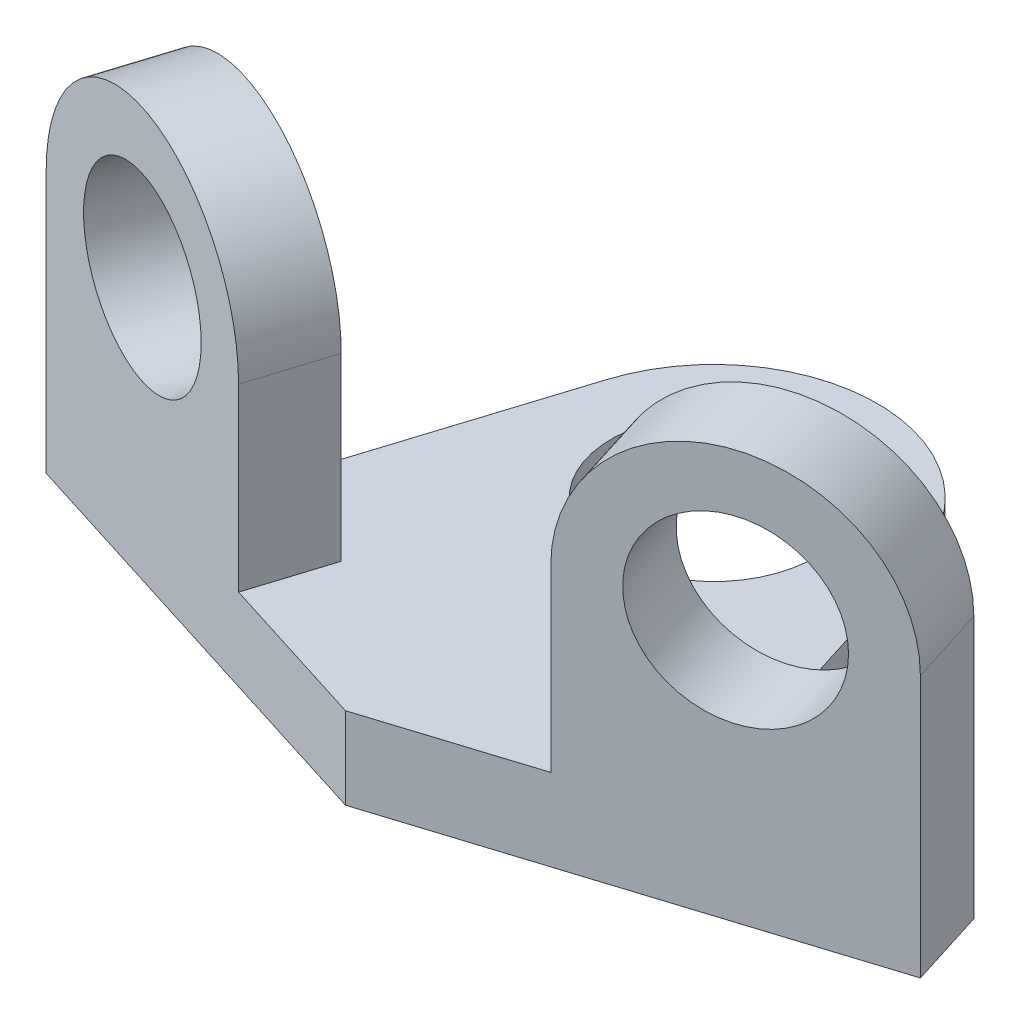
ISO-10303-21;
HEADER;
FILE_DESCRIPTION(('STEP AP214'),'2;1');
FILE_NAME('part.step','',(''),(''),'','','');
FILE_SCHEMA(('AUTOMOTIVE_DESIGN { 1 0 10303 214 1 1 1 1 }'));
ENDSEC;
DATA;
#1=APPLICATION_CONTEXT('core data for automotive mechanical design processes');
#2=APPLICATION_PROTOCOL_DEFINITION('international standard','automotive_design',2000,#1);
#3=PRODUCT_CONTEXT('',#1,'mechanical');
#4=PRODUCT('Part','Part','',(#3));
#5=PRODUCT_RELATED_PRODUCT_CATEGORY('part','',(#4));
#6=PRODUCT_DEFINITION_FORMATION('','',#4);
#7=PRODUCT_DEFINITION_CONTEXT('part definition',#1,'design');
#8=PRODUCT_DEFINITION('design','',#6,#7);
#9=PRODUCT_DEFINITION_SHAPE('','',#8);
#10=(LENGTH_UNIT() NAMED_UNIT(*) SI_UNIT(.MILLI.,.METRE.));
#11=(NAMED_UNIT(*) PLANE_ANGLE_UNIT() SI_UNIT($,.RADIAN.));
#12=(NAMED_UNIT(*) SI_UNIT($,.STERADIAN.) SOLID_ANGLE_UNIT());
#13=UNCERTAINTY_MEASURE_WITH_UNIT(LENGTH_MEASURE(1.E-05),#10,'distance_accuracy_value','');
#14=(GEOMETRIC_REPRESENTATION_CONTEXT(3) GLOBAL_UNCERTAINTY_ASSIGNED_CONTEXT((#13)) GLOBAL_UNIT_ASSIGNED_CONTEXT((#10,
#11,#12)) REPRESENTATION_CONTEXT('',''));
#15=CARTESIAN_POINT('',(0.,0.,0.));
#16=DIRECTION('',(0.,0.,1.));
#17=DIRECTION('',(1.,0.,0.));
#18=AXIS2_PLACEMENT_3D('',#15,#16,#17);
#19=CARTESIAN_POINT('',(-12.9054698178985,10.,40.9309209965023));
#20=DIRECTION('',(-0.300705799504273,0.,0.953716950748227));
#21=DIRECTION('',(0.953716950748227,0.,0.300705799504273));
#22=AXIS2_PLACEMENT_3D('',#19,#20,#21);
#23=PLANE('',#22);
#24=CARTESIAN_POINT('',(-36.2412441284326,32.,33.5731796188376));
#25=DIRECTION('',(-0.300705799504273,0.,0.953716950748227));
#26=DIRECTION('',(0.953716950748227,0.,0.300705799504273));
#27=AXIS2_PLACEMENT_3D('',#24,#25,#26);
#28=CIRCLE('',#27,11.);
#29=CARTESIAN_POINT('',(-25.7503576702021,32.,36.8809434133846));
#30=VERTEX_POINT('',#29);
#31=EDGE_CURVE('E298',#30,#30,#28,.T.);
#32=ORIENTED_EDGE('',*,*,#31,.F.);
#33=EDGE_LOOP('',(#32));
#34=FACE_BOUND('',#33,.T.);
#35=DIRECTION('',(0.,-1.,0.));
#36=VECTOR('',#35,1.);
#37=CARTESIAN_POINT('',(-19.0743390149645,32.,38.9858840099145));
#38=LINE('',#37,#36);
#39=CARTESIAN_POINT('',(-19.0743390149645,32.,38.9858840099145));
#40=VERTEX_POINT('',#39);
#41=CARTESIAN_POINT('',(-19.0743390149645,10.,38.9858840099145));
#42=VERTEX_POINT('',#41);
#43=EDGE_CURVE('E220',#40,#42,#38,.T.);
#44=ORIENTED_EDGE('',*,*,#43,.F.);
#45=CARTESIAN_POINT('',(-36.2412441284326,32.,33.5731796188376));
#46=DIRECTION('',(-0.300705799504273,0.,0.953716950748227));
#47=DIRECTION('',(0.953716950748227,0.,0.300705799504273));
#48=AXIS2_PLACEMENT_3D('',#45,#46,#47);
#49=CIRCLE('',#48,18.);
#50=CARTESIAN_POINT('',(-53.4081492419007,32.,28.1604752277607));
#51=VERTEX_POINT('',#50);
#52=EDGE_CURVE('E287',#40,#51,#49,.T.);
#53=ORIENTED_EDGE('',*,*,#52,.T.);
#54=DIRECTION('',(0.,-1.,0.));
#55=VECTOR('',#54,1.);
#56=CARTESIAN_POINT('',(-53.4081492419007,32.,28.1604752277607));
#57=LINE('',#56,#55);
#58=CARTESIAN_POINT('',(-53.4081492419007,0.,28.1604752277607));
#59=VERTEX_POINT('',#58);
#60=EDGE_CURVE('E146',#51,#59,#57,.T.);
#61=ORIENTED_EDGE('',*,*,#60,.T.);
#62=DIRECTION('',(-0.953716950748227,0.,-0.300705799504273));
#63=VECTOR('',#62,1.);
#64=CARTESIAN_POINT('',(-12.9054698178985,0.,40.9309209965023));
#65=LINE('',#64,#63);
#66=CARTESIAN_POINT('',(0.,0.,45.));
#67=VERTEX_POINT('',#66);
#68=EDGE_CURVE('E141',#67,#59,#65,.T.);
#69=ORIENTED_EDGE('',*,*,#68,.F.);
#70=DIRECTION('',(0.,-1.,0.));
#71=VECTOR('',#70,1.);
#72=CARTESIAN_POINT('',(0.,10.,45.));
#73=LINE('',#72,#71);
#74=CARTESIAN_POINT('',(0.,10.,45.));
#75=VERTEX_POINT('',#74);
#76=EDGE_CURVE('E12',#75,#67,#73,.T.);
#77=ORIENTED_EDGE('',*,*,#76,.F.);
#78=DIRECTION('',(-0.953716950748227,0.,-0.300705799504273));
#79=VECTOR('',#78,1.);
#80=CARTESIAN_POINT('',(-12.9054698178985,10.,40.9309209965023));
#81=LINE('',#80,#79);
#82=EDGE_CURVE('E66',#75,#42,#81,.T.);
#83=ORIENTED_EDGE('',*,*,#82,.T.);
#84=EDGE_LOOP('',(#44,#53,#61,#69,#77,#83));
#85=FACE_BOUND('',#84,.T.);
#86=ADVANCED_FACE('F51',(#34,#85),#23,.T.);
#87=CARTESIAN_POINT('',(12.9054698178986,10.,40.9309209965023));
#88=DIRECTION('',(-0.300705799504274,0.,-0.953716950748227));
#89=DIRECTION('',(-0.953716950748227,0.,0.300705799504274));
#90=AXIS2_PLACEMENT_3D('',#87,#88,#89);
#91=PLANE('',#90);
#92=CARTESIAN_POINT('',(36.2412441284326,32.,33.5731796188376));
#93=DIRECTION('',(0.300705799504274,0.,0.953716950748227));
#94=DIRECTION('',(0.953716950748227,0.,-0.300705799504274));
#95=AXIS2_PLACEMENT_3D('',#92,#93,#94);
#96=CIRCLE('',#95,11.);
#97=CARTESIAN_POINT('',(46.7321305866631,32.,30.2654158242906));
#98=VERTEX_POINT('',#97);
#99=EDGE_CURVE('E279',#98,#98,#96,.T.);
#100=ORIENTED_EDGE('',*,*,#99,.F.);
#101=EDGE_LOOP('',(#100));
#102=FACE_BOUND('',#101,.T.);
#103=CARTESIAN_POINT('',(36.2412441284326,32.,33.5731796188376));
#104=DIRECTION('',(0.300705799504274,0.,0.953716950748227));
#105=DIRECTION('',(0.953716950748227,0.,-0.300705799504274));
#106=AXIS2_PLACEMENT_3D('',#103,#104,#105);
#107=CIRCLE('',#106,18.);
#108=CARTESIAN_POINT('',(53.4081492419007,32.,28.1604752277607));
#109=VERTEX_POINT('',#108);
#110=CARTESIAN_POINT('',(19.0743390149645,32.,38.9858840099145));
#111=VERTEX_POINT('',#110);
#112=EDGE_CURVE('E272',#109,#111,#107,.T.);
#113=ORIENTED_EDGE('',*,*,#112,.T.);
#114=DIRECTION('',(0.,-1.,0.));
#115=VECTOR('',#114,1.);
#116=CARTESIAN_POINT('',(19.0743390149645,32.,38.9858840099145));
#117=LINE('',#116,#115);
#118=CARTESIAN_POINT('',(19.0743390149645,10.,38.9858840099145));
#119=VERTEX_POINT('',#118);
#120=EDGE_CURVE('E242',#111,#119,#117,.T.);
#121=ORIENTED_EDGE('',*,*,#120,.T.);
#122=DIRECTION('',(0.953716950748227,0.,-0.300705799504274));
#123=VECTOR('',#122,1.);
#124=CARTESIAN_POINT('',(12.9054698178986,10.,40.9309209965023));
#125=LINE('',#124,#123);
#126=EDGE_CURVE('E251',#75,#119,#125,.T.);
#127=ORIENTED_EDGE('',*,*,#126,.F.);
#128=ORIENTED_EDGE('',*,*,#76,.T.);
#129=DIRECTION('',(0.953716950748227,0.,-0.300705799504274));
#130=VECTOR('',#129,1.);
#131=CARTESIAN_POINT('',(12.9054698178986,0.,40.9309209965023));
#132=LINE('',#131,#130);
#133=CARTESIAN_POINT('',(53.4081492419007,0.,28.1604752277607));
#134=VERTEX_POINT('',#133);
#135=EDGE_CURVE('E150',#67,#134,#132,.T.);
#136=ORIENTED_EDGE('',*,*,#135,.T.);
#137=DIRECTION('',(0.,-1.,0.));
#138=VECTOR('',#137,1.);
#139=CARTESIAN_POINT('',(53.4081492419007,32.,28.1604752277607));
#140=LINE('',#139,#138);
#141=EDGE_CURVE('E243',#109,#134,#140,.T.);
#142=ORIENTED_EDGE('',*,*,#141,.F.);
#143=EDGE_LOOP('',(#113,#121,#127,#128,#136,#142));
#144=FACE_BOUND('',#143,.T.);
#145=ADVANCED_FACE('F318',(#102,#144),#91,.F.);
#146=CARTESIAN_POINT('',(19.0743390149645,10.,-6.01411599008548));
#147=DIRECTION('',(0.953716950748227,0.,-0.300705799504274));
#148=DIRECTION('',(-0.300705799504274,0.,-0.953716950748227));
#149=AXIS2_PLACEMENT_3D('',#146,#147,#148);
#150=PLANE('',#149);
#151=DIRECTION('',(0.300705799504274,0.,0.953716950748227));
#152=VECTOR('',#151,1.);
#153=CARTESIAN_POINT('',(19.0743390149645,0.,-6.01411599008548));
#154=LINE('',#153,#152);
#155=CARTESIAN_POINT('',(19.0743390149645,0.,-6.01411599008548));
#156=VERTEX_POINT('',#155);
#157=CARTESIAN_POINT('',(28.9727508378204,0.,25.3796354989345));
#158=VERTEX_POINT('',#157);
#159=EDGE_CURVE('E155',#156,#158,#154,.T.);
#160=ORIENTED_EDGE('',*,*,#159,.F.);
#161=DIRECTION('',(0.,-1.,0.));
#162=VECTOR('',#161,1.);
#163=CARTESIAN_POINT('',(19.0743390149645,10.,-6.01411599008548));
#164=LINE('',#163,#162);
#165=CARTESIAN_POINT('',(19.0743390149645,10.,-6.01411599008548));
#166=VERTEX_POINT('',#165);
#167=EDGE_CURVE('E122',#166,#156,#164,.T.);
#168=ORIENTED_EDGE('',*,*,#167,.F.);
#169=DIRECTION('',(0.300705799504274,0.,0.953716950748227));
#170=VECTOR('',#169,1.);
#171=CARTESIAN_POINT('',(19.0743390149645,10.,-6.01411599008548));
#172=LINE('',#171,#170);
#173=CARTESIAN_POINT('',(28.9727508378204,10.,25.3796354989345));
#174=VERTEX_POINT('',#173);
#175=EDGE_CURVE('E116',#166,#174,#172,.T.);
#176=ORIENTED_EDGE('',*,*,#175,.T.);
#177=DIRECTION('',(0.,-1.,0.));
#178=VECTOR('',#177,1.);
#179=CARTESIAN_POINT('',(28.9727508378204,10.,25.3796354989345));
#180=LINE('',#179,#178);
#181=EDGE_CURVE('E58',#174,#158,#180,.T.);
#182=ORIENTED_EDGE('',*,*,#181,.T.);
#183=EDGE_LOOP('',(#160,#168,#176,#182));
#184=FACE_BOUND('',#183,.T.);
#185=ADVANCED_FACE('F171',(#184),#150,.T.);
#186=CARTESIAN_POINT('',(0.,10.,0.));
#187=DIRECTION('',(0.,-1.,0.));
#188=DIRECTION('',(0.,0.,-1.));
#189=AXIS2_PLACEMENT_3D('',#186,#187,#188);
#190=CYLINDRICAL_SURFACE('',#189,20.);
#191=CARTESIAN_POINT('',(0.,0.,0.));
#192=DIRECTION('',(0.,1.,0.));
#193=DIRECTION('',(0.,0.,1.));
#194=AXIS2_PLACEMENT_3D('',#191,#192,#193);
#195=CIRCLE('',#194,20.);
#196=CARTESIAN_POINT('',(-19.0743390149645,0.,-6.01411599008548));
#197=VERTEX_POINT('',#196);
#198=EDGE_CURVE('E84',#156,#197,#195,.T.);
#199=ORIENTED_EDGE('',*,*,#198,.T.);
#200=DIRECTION('',(0.,-1.,0.));
#201=VECTOR('',#200,1.);
#202=CARTESIAN_POINT('',(-19.0743390149645,10.,-6.01411599008548));
#203=LINE('',#202,#201);
#204=CARTESIAN_POINT('',(-19.0743390149645,10.,-6.01411599008548));
#205=VERTEX_POINT('',#204);
#206=EDGE_CURVE('E123',#205,#197,#203,.T.);
#207=ORIENTED_EDGE('',*,*,#206,.F.);
#208=CARTESIAN_POINT('',(0.,10.,0.));
#209=DIRECTION('',(0.,1.,0.));
#210=DIRECTION('',(0.,0.,1.));
#211=AXIS2_PLACEMENT_3D('',#208,#209,#210);
#212=CIRCLE('',#211,20.);
#213=EDGE_CURVE('E109',#166,#205,#212,.T.);
#214=ORIENTED_EDGE('',*,*,#213,.F.);
#215=ORIENTED_EDGE('',*,*,#167,.T.);
#216=EDGE_LOOP('',(#199,#207,#214,#215));
#217=FACE_BOUND('',#216,.T.);
#218=ADVANCED_FACE('F125',(#217),#190,.T.);
#219=CARTESIAN_POINT('',(-19.0743390149645,10.,-6.01411599008547));
#220=DIRECTION('',(0.953716950748227,0.,0.300705799504274));
#221=DIRECTION('',(0.300705799504274,0.,-0.953716950748227));
#222=AXIS2_PLACEMENT_3D('',#219,#220,#221);
#223=PLANE('',#222);
#224=DIRECTION('',(-0.300705799504274,0.,0.953716950748227));
#225=VECTOR('',#224,1.);
#226=CARTESIAN_POINT('',(-19.0743390149645,0.,-6.01411599008547));
#227=LINE('',#226,#225);
#228=CARTESIAN_POINT('',(-28.9727508378203,0.,25.3796354989345));
#229=VERTEX_POINT('',#228);
#230=EDGE_CURVE('E95',#197,#229,#227,.T.);
#231=ORIENTED_EDGE('',*,*,#230,.T.);
#232=DIRECTION('',(0.,-1.,0.));
#233=VECTOR('',#232,1.);
#234=CARTESIAN_POINT('',(-28.9727508378203,10.,25.3796354989345));
#235=LINE('',#234,#233);
#236=CARTESIAN_POINT('',(-28.9727508378203,10.,25.3796354989345));
#237=VERTEX_POINT('',#236);
#238=EDGE_CURVE('E124',#237,#229,#235,.T.);
#239=ORIENTED_EDGE('',*,*,#238,.F.);
#240=DIRECTION('',(-0.300705799504274,0.,0.953716950748227));
#241=VECTOR('',#240,1.);
#242=CARTESIAN_POINT('',(-19.0743390149645,10.,-6.01411599008547));
#243=LINE('',#242,#241);
#244=EDGE_CURVE('E111',#205,#237,#243,.T.);
#245=ORIENTED_EDGE('',*,*,#244,.F.);
#246=ORIENTED_EDGE('',*,*,#206,.T.);
#247=EDGE_LOOP('',(#231,#239,#245,#246));
#248=FACE_BOUND('',#247,.T.);
#249=ADVANCED_FACE('F130',(#248),#223,.F.);
#250=CARTESIAN_POINT('',(0.,10.,0.));
#251=DIRECTION('',(0.,-1.,0.));
#252=DIRECTION('',(0.,0.,-1.));
#253=AXIS2_PLACEMENT_3D('',#250,#251,#252);
#254=CYLINDRICAL_SURFACE('',#253,12.5);
#255=CARTESIAN_POINT('',(0.,10.,0.));
#256=DIRECTION('',(0.,1.,0.));
#257=DIRECTION('',(0.,0.,1.));
#258=AXIS2_PLACEMENT_3D('',#255,#256,#257);
#259=CIRCLE('',#258,12.5);
#260=CARTESIAN_POINT('',(0.,10.,12.5));
#261=VERTEX_POINT('',#260);
#262=EDGE_CURVE('E137',#261,#261,#259,.T.);
#263=ORIENTED_EDGE('',*,*,#262,.T.);
#264=EDGE_LOOP('',(#263));
#265=FACE_BOUND('',#264,.T.);
#266=CARTESIAN_POINT('',(0.,0.,0.));
#267=DIRECTION('',(0.,1.,0.));
#268=DIRECTION('',(0.,0.,1.));
#269=AXIS2_PLACEMENT_3D('',#266,#267,#268);
#270=CIRCLE('',#269,12.5);
#271=CARTESIAN_POINT('',(0.,0.,12.5));
#272=VERTEX_POINT('',#271);
#273=EDGE_CURVE('E159',#272,#272,#270,.T.);
#274=ORIENTED_EDGE('',*,*,#273,.F.);
#275=EDGE_LOOP('',(#274));
#276=FACE_BOUND('',#275,.T.);
#277=ADVANCED_FACE('F379',(#265,#276),#254,.F.);
#278=CARTESIAN_POINT('',(0.,10.,0.));
#279=DIRECTION('',(0.,1.,0.));
#280=DIRECTION('',(0.,0.,1.));
#281=AXIS2_PLACEMENT_3D('',#278,#279,#280);
#282=PLANE('',#281);
#283=ORIENTED_EDGE('',*,*,#82,.F.);
#284=ORIENTED_EDGE('',*,*,#126,.T.);
#285=DIRECTION('',(-0.300705799504275,0.,-0.953716950748226));
#286=VECTOR('',#285,1.);
#287=CARTESIAN_POINT('',(6.16886919706593,10.,-1.94503698658777));
#288=LINE('',#287,#286);
#289=CARTESIAN_POINT('',(16.0672810199218,10.,29.4487145024323));
#290=VERTEX_POINT('',#289);
#291=EDGE_CURVE('E260',#119,#290,#288,.T.);
#292=ORIENTED_EDGE('',*,*,#291,.T.);
#293=DIRECTION('',(0.953716950748226,0.,-0.300705799504274));
#294=VECTOR('',#293,1.);
#295=CARTESIAN_POINT('',(9.89841182285585,10.,31.39375148902));
#296=LINE('',#295,#294);
#297=EDGE_CURVE('E261',#290,#174,#296,.T.);
#298=ORIENTED_EDGE('',*,*,#297,.T.);
#299=ORIENTED_EDGE('',*,*,#175,.F.);
#300=ORIENTED_EDGE('',*,*,#213,.T.);
#301=ORIENTED_EDGE('',*,*,#244,.T.);
#302=DIRECTION('',(-0.953716950748227,0.,-0.300705799504273));
#303=VECTOR('',#302,1.);
#304=CARTESIAN_POINT('',(-9.89841182285581,10.,31.39375148902));
#305=LINE('',#304,#303);
#306=CARTESIAN_POINT('',(-16.0672810199218,10.,29.4487145024322));
#307=VERTEX_POINT('',#306);
#308=EDGE_CURVE('E129',#307,#237,#305,.T.);
#309=ORIENTED_EDGE('',*,*,#308,.F.);
#310=DIRECTION('',(0.300705799504274,0.,-0.953716950748227));
#311=VECTOR('',#310,1.);
#312=CARTESIAN_POINT('',(-6.16886919706599,10.,-1.94503698658778));
#313=LINE('',#312,#311);
#314=EDGE_CURVE('E135',#42,#307,#313,.T.);
#315=ORIENTED_EDGE('',*,*,#314,.F.);
#316=EDGE_LOOP('',(#283,#284,#292,#298,#299,#300,#301,#309,#315));
#317=FACE_BOUND('',#316,.T.);
#318=ORIENTED_EDGE('',*,*,#262,.F.);
#319=EDGE_LOOP('',(#318));
#320=FACE_BOUND('',#319,.T.);
#321=ADVANCED_FACE('F112',(#317,#320),#282,.T.);
#322=CARTESIAN_POINT('',(0.,0.,0.));
#323=DIRECTION('',(0.,1.,0.));
#324=DIRECTION('',(0.,0.,1.));
#325=AXIS2_PLACEMENT_3D('',#322,#323,#324);
#326=PLANE('',#325);
#327=DIRECTION('',(-0.953716950748227,0.,-0.300705799504273));
#328=VECTOR('',#327,1.);
#329=CARTESIAN_POINT('',(-9.89841182285581,0.,31.39375148902));
#330=LINE('',#329,#328);
#331=CARTESIAN_POINT('',(-50.401091246858,0.,18.6233057202784));
#332=VERTEX_POINT('',#331);
#333=EDGE_CURVE('E193',#229,#332,#330,.T.);
#334=ORIENTED_EDGE('',*,*,#333,.F.);
#335=ORIENTED_EDGE('',*,*,#230,.F.);
#336=ORIENTED_EDGE('',*,*,#198,.F.);
#337=ORIENTED_EDGE('',*,*,#159,.T.);
#338=DIRECTION('',(0.953716950748226,0.,-0.300705799504274));
#339=VECTOR('',#338,1.);
#340=CARTESIAN_POINT('',(9.89841182285585,0.,31.39375148902));
#341=LINE('',#340,#339);
#342=CARTESIAN_POINT('',(50.4010912468579,0.,18.6233057202784));
#343=VERTEX_POINT('',#342);
#344=EDGE_CURVE('E190',#158,#343,#341,.T.);
#345=ORIENTED_EDGE('',*,*,#344,.T.);
#346=DIRECTION('',(0.300705799504274,0.,0.953716950748227));
#347=VECTOR('',#346,1.);
#348=CARTESIAN_POINT('',(40.5026794240021,0.,-12.7704457687416));
#349=LINE('',#348,#347);
#350=EDGE_CURVE('E229',#343,#134,#349,.T.);
#351=ORIENTED_EDGE('',*,*,#350,.T.);
#352=ORIENTED_EDGE('',*,*,#135,.F.);
#353=ORIENTED_EDGE('',*,*,#68,.T.);
#354=DIRECTION('',(-0.300705799504273,0.,0.953716950748227));
#355=VECTOR('',#354,1.);
#356=CARTESIAN_POINT('',(-40.5026794240022,0.,-12.7704457687416));
#357=LINE('',#356,#355);
#358=EDGE_CURVE('E192',#332,#59,#357,.T.);
#359=ORIENTED_EDGE('',*,*,#358,.F.);
#360=EDGE_LOOP('',(#334,#335,#336,#337,#345,#351,#352,#353,#359));
#361=FACE_BOUND('',#360,.T.);
#362=ORIENTED_EDGE('',*,*,#273,.T.);
#363=EDGE_LOOP('',(#362));
#364=FACE_BOUND('',#363,.T.);
#365=ADVANCED_FACE('F181',(#361,#364),#326,.F.);
#366=CARTESIAN_POINT('',(9.89841182285585,32.,31.39375148902));
#367=DIRECTION('',(-0.300705799504274,0.,-0.953716950748226));
#368=DIRECTION('',(-0.953716950748226,0.,0.300705799504274));
#369=AXIS2_PLACEMENT_3D('',#366,#367,#368);
#370=PLANE('',#369);
#371=CARTESIAN_POINT('',(33.2341861333899,32.,24.0360101113553));
#372=DIRECTION('',(0.300705799504274,0.,0.953716950748227));
#373=DIRECTION('',(0.953716950748227,0.,-0.300705799504274));
#374=AXIS2_PLACEMENT_3D('',#371,#372,#373);
#375=CIRCLE('',#374,11.);
#376=CARTESIAN_POINT('',(43.7250725916204,32.,20.7282463168083));
#377=VERTEX_POINT('',#376);
#378=EDGE_CURVE('E280',#377,#377,#375,.T.);
#379=ORIENTED_EDGE('',*,*,#378,.T.);
#380=EDGE_LOOP('',(#379));
#381=FACE_BOUND('',#380,.T.);
#382=DIRECTION('',(0.,-1.,0.));
#383=VECTOR('',#382,1.);
#384=CARTESIAN_POINT('',(16.0672810199218,32.,29.4487145024323));
#385=LINE('',#384,#383);
#386=CARTESIAN_POINT('',(16.0672810199218,32.,29.4487145024323));
#387=VERTEX_POINT('',#386);
#388=EDGE_CURVE('E206',#387,#290,#385,.T.);
#389=ORIENTED_EDGE('',*,*,#388,.F.);
#390=CARTESIAN_POINT('',(33.2341861333899,32.,24.0360101113553));
#391=DIRECTION('',(0.300705799504274,0.,0.953716950748227));
#392=DIRECTION('',(0.953716950748227,0.,-0.300705799504274));
#393=AXIS2_PLACEMENT_3D('',#390,#391,#392);
#394=CIRCLE('',#393,18.);
#395=CARTESIAN_POINT('',(50.401091246858,32.,18.6233057202784));
#396=VERTEX_POINT('',#395);
#397=EDGE_CURVE('E237',#396,#387,#394,.T.);
#398=ORIENTED_EDGE('',*,*,#397,.F.);
#399=DIRECTION('',(0.,-1.,0.));
#400=VECTOR('',#399,1.);
#401=CARTESIAN_POINT('',(50.4010912468579,32.,18.6233057202784));
#402=LINE('',#401,#400);
#403=EDGE_CURVE('E231',#396,#343,#402,.T.);
#404=ORIENTED_EDGE('',*,*,#403,.T.);
#405=ORIENTED_EDGE('',*,*,#344,.F.);
#406=ORIENTED_EDGE('',*,*,#181,.F.);
#407=ORIENTED_EDGE('',*,*,#297,.F.);
#408=EDGE_LOOP('',(#389,#398,#404,#405,#406,#407));
#409=FACE_BOUND('',#408,.T.);
#410=ADVANCED_FACE('F364',(#381,#409),#370,.T.);
#411=CARTESIAN_POINT('',(6.16886919706593,32.,-1.94503698658777));
#412=DIRECTION('',(-0.953716950748226,0.,0.300705799504275));
#413=DIRECTION('',(0.300705799504275,0.,0.953716950748226));
#414=AXIS2_PLACEMENT_3D('',#411,#412,#413);
#415=PLANE('',#414);
#416=ORIENTED_EDGE('',*,*,#388,.T.);
#417=ORIENTED_EDGE('',*,*,#291,.F.);
#418=ORIENTED_EDGE('',*,*,#120,.F.);
#419=DIRECTION('',(-0.300705799504275,0.,-0.953716950748226));
#420=VECTOR('',#419,1.);
#421=CARTESIAN_POINT('',(6.16886919706593,32.,-1.94503698658777));
#422=LINE('',#421,#420);
#423=EDGE_CURVE('E221',#111,#387,#422,.T.);
#424=ORIENTED_EDGE('',*,*,#423,.T.);
#425=EDGE_LOOP('',(#416,#417,#418,#424));
#426=FACE_BOUND('',#425,.T.);
#427=ADVANCED_FACE('F356',(#426),#415,.T.);
#428=CARTESIAN_POINT('',(40.5026794240021,32.,-12.7704457687416));
#429=DIRECTION('',(0.953716950748227,0.,-0.300705799504274));
#430=DIRECTION('',(-0.300705799504274,0.,-0.953716950748227));
#431=AXIS2_PLACEMENT_3D('',#428,#429,#430);
#432=PLANE('',#431);
#433=ORIENTED_EDGE('',*,*,#350,.F.);
#434=ORIENTED_EDGE('',*,*,#403,.F.);
#435=DIRECTION('',(0.300705799504274,0.,0.953716950748227));
#436=VECTOR('',#435,1.);
#437=CARTESIAN_POINT('',(40.5026794240021,32.,-12.7704457687416));
#438=LINE('',#437,#436);
#439=EDGE_CURVE('E226',#396,#109,#438,.T.);
#440=ORIENTED_EDGE('',*,*,#439,.T.);
#441=ORIENTED_EDGE('',*,*,#141,.T.);
#442=EDGE_LOOP('',(#433,#434,#440,#441));
#443=FACE_BOUND('',#442,.T.);
#444=ADVANCED_FACE('F373',(#443),#432,.T.);
#445=CARTESIAN_POINT('',(-9.89841182285581,32.,31.39375148902));
#446=DIRECTION('',(-0.300705799504273,0.,0.953716950748227));
#447=DIRECTION('',(0.953716950748227,0.,0.300705799504273));
#448=AXIS2_PLACEMENT_3D('',#445,#446,#447);
#449=PLANE('',#448);
#450=CARTESIAN_POINT('',(-33.2341861333899,32.,24.0360101113553));
#451=DIRECTION('',(-0.300705799504273,0.,0.953716950748227));
#452=DIRECTION('',(0.953716950748227,0.,0.300705799504273));
#453=AXIS2_PLACEMENT_3D('',#450,#451,#452);
#454=CIRCLE('',#453,11.);
#455=CARTESIAN_POINT('',(-22.7432996751594,32.,27.3437739059023));
#456=VERTEX_POINT('',#455);
#457=EDGE_CURVE('E291',#456,#456,#454,.T.);
#458=ORIENTED_EDGE('',*,*,#457,.T.);
#459=EDGE_LOOP('',(#458));
#460=FACE_BOUND('',#459,.T.);
#461=DIRECTION('',(0.,-1.,0.));
#462=VECTOR('',#461,1.);
#463=CARTESIAN_POINT('',(-50.401091246858,32.,18.6233057202784));
#464=LINE('',#463,#462);
#465=CARTESIAN_POINT('',(-50.401091246858,32.,18.6233057202784));
#466=VERTEX_POINT('',#465);
#467=EDGE_CURVE('E209',#466,#332,#464,.T.);
#468=ORIENTED_EDGE('',*,*,#467,.F.);
#469=CARTESIAN_POINT('',(-33.2341861333899,32.,24.0360101113553));
#470=DIRECTION('',(-0.300705799504273,0.,0.953716950748227));
#471=DIRECTION('',(0.953716950748227,0.,0.300705799504273));
#472=AXIS2_PLACEMENT_3D('',#469,#470,#471);
#473=CIRCLE('',#472,18.);
#474=CARTESIAN_POINT('',(-16.0672810199218,32.,29.4487145024323));
#475=VERTEX_POINT('',#474);
#476=EDGE_CURVE('E285',#475,#466,#473,.T.);
#477=ORIENTED_EDGE('',*,*,#476,.F.);
#478=DIRECTION('',(0.,-1.,0.));
#479=VECTOR('',#478,1.);
#480=CARTESIAN_POINT('',(-16.0672810199218,32.,29.4487145024322));
#481=LINE('',#480,#479);
#482=EDGE_CURVE('E213',#475,#307,#481,.T.);
#483=ORIENTED_EDGE('',*,*,#482,.T.);
#484=ORIENTED_EDGE('',*,*,#308,.T.);
#485=ORIENTED_EDGE('',*,*,#238,.T.);
#486=ORIENTED_EDGE('',*,*,#333,.T.);
#487=EDGE_LOOP('',(#468,#477,#483,#484,#485,#486));
#488=FACE_BOUND('',#487,.T.);
#489=ADVANCED_FACE('F302',(#460,#488),#449,.F.);
#490=CARTESIAN_POINT('',(-40.5026794240022,32.,-12.7704457687416));
#491=DIRECTION('',(0.953716950748227,0.,0.300705799504273));
#492=DIRECTION('',(0.300705799504273,0.,-0.953716950748227));
#493=AXIS2_PLACEMENT_3D('',#490,#491,#492);
#494=PLANE('',#493);
#495=ORIENTED_EDGE('',*,*,#358,.T.);
#496=ORIENTED_EDGE('',*,*,#60,.F.);
#497=DIRECTION('',(-0.300705799504273,0.,0.953716950748227));
#498=VECTOR('',#497,1.);
#499=CARTESIAN_POINT('',(-40.5026794240022,32.,-12.7704457687416));
#500=LINE('',#499,#498);
#501=EDGE_CURVE('E200',#466,#51,#500,.T.);
#502=ORIENTED_EDGE('',*,*,#501,.F.);
#503=ORIENTED_EDGE('',*,*,#467,.T.);
#504=EDGE_LOOP('',(#495,#496,#502,#503));
#505=FACE_BOUND('',#504,.T.);
#506=ADVANCED_FACE('F476',(#505),#494,.F.);
#507=CARTESIAN_POINT('',(-6.16886919706599,32.,-1.94503698658778));
#508=DIRECTION('',(-0.953716950748227,0.,-0.300705799504274));
#509=DIRECTION('',(-0.300705799504274,0.,0.953716950748227));
#510=AXIS2_PLACEMENT_3D('',#507,#508,#509);
#511=PLANE('',#510);
#512=ORIENTED_EDGE('',*,*,#314,.T.);
#513=ORIENTED_EDGE('',*,*,#482,.F.);
#514=DIRECTION('',(0.300705799504274,0.,-0.953716950748227));
#515=VECTOR('',#514,1.);
#516=CARTESIAN_POINT('',(-6.16886919706599,32.,-1.94503698658778));
#517=LINE('',#516,#515);
#518=EDGE_CURVE('E204',#40,#475,#517,.T.);
#519=ORIENTED_EDGE('',*,*,#518,.F.);
#520=ORIENTED_EDGE('',*,*,#43,.T.);
#521=EDGE_LOOP('',(#512,#513,#519,#520));
#522=FACE_BOUND('',#521,.T.);
#523=ADVANCED_FACE('F332',(#522),#511,.F.);
#524=CARTESIAN_POINT('',(33.2341861333899,32.,24.0360101113553));
#525=DIRECTION('',(0.300705799504274,0.,0.953716950748227));
#526=DIRECTION('',(0.953716950748227,0.,-0.300705799504274));
#527=AXIS2_PLACEMENT_3D('',#524,#525,#526);
#528=CYLINDRICAL_SURFACE('',#527,11.);
#529=ORIENTED_EDGE('',*,*,#99,.T.);
#530=EDGE_LOOP('',(#529));
#531=FACE_BOUND('',#530,.T.);
#532=ORIENTED_EDGE('',*,*,#378,.F.);
#533=EDGE_LOOP('',(#532));
#534=FACE_BOUND('',#533,.T.);
#535=ADVANCED_FACE('F435',(#531,#534),#528,.F.);
#536=CARTESIAN_POINT('',(33.2341861333899,32.,24.0360101113553));
#537=DIRECTION('',(0.300705799504274,0.,0.953716950748227));
#538=DIRECTION('',(0.953716950748227,0.,-0.300705799504274));
#539=AXIS2_PLACEMENT_3D('',#536,#537,#538);
#540=CYLINDRICAL_SURFACE('',#539,18.);
#541=ORIENTED_EDGE('',*,*,#397,.T.);
#542=ORIENTED_EDGE('',*,*,#423,.F.);
#543=ORIENTED_EDGE('',*,*,#112,.F.);
#544=ORIENTED_EDGE('',*,*,#439,.F.);
#545=EDGE_LOOP('',(#541,#542,#543,#544));
#546=FACE_BOUND('',#545,.T.);
#547=ADVANCED_FACE('F312',(#546),#540,.T.);
#548=CARTESIAN_POINT('',(-33.2341861333899,32.,24.0360101113553));
#549=DIRECTION('',(-0.300705799504273,0.,0.953716950748227));
#550=DIRECTION('',(0.953716950748227,0.,0.300705799504273));
#551=AXIS2_PLACEMENT_3D('',#548,#549,#550);
#552=CYLINDRICAL_SURFACE('',#551,18.);
#553=ORIENTED_EDGE('',*,*,#476,.T.);
#554=ORIENTED_EDGE('',*,*,#501,.T.);
#555=ORIENTED_EDGE('',*,*,#52,.F.);
#556=ORIENTED_EDGE('',*,*,#518,.T.);
#557=EDGE_LOOP('',(#553,#554,#555,#556));
#558=FACE_BOUND('',#557,.T.);
#559=ADVANCED_FACE('F306',(#558),#552,.T.);
#560=CARTESIAN_POINT('',(-33.2341861333899,32.,24.0360101113553));
#561=DIRECTION('',(-0.300705799504273,0.,0.953716950748227));
#562=DIRECTION('',(0.953716950748227,0.,0.300705799504273));
#563=AXIS2_PLACEMENT_3D('',#560,#561,#562);
#564=CYLINDRICAL_SURFACE('',#563,11.);
#565=ORIENTED_EDGE('',*,*,#31,.T.);
#566=EDGE_LOOP('',(#565));
#567=FACE_BOUND('',#566,.T.);
#568=ORIENTED_EDGE('',*,*,#457,.F.);
#569=EDGE_LOOP('',(#568));
#570=FACE_BOUND('',#569,.T.);
#571=ADVANCED_FACE('F308',(#567,#570),#564,.F.);
#572=CLOSED_SHELL('',(#86,#145,#185,#218,#249,#277,#321,#365,#410,#427,#444,#489,#506,#523,#535,
#547,#559,#571));
#573=MANIFOLD_SOLID_BREP('B2',#572);
#574=ADVANCED_BREP_SHAPE_REPRESENTATION('',(#18,#573),#14);
#575=SHAPE_DEFINITION_REPRESENTATION(#9,#574);
ENDSEC;
END-ISO-10303-21;
